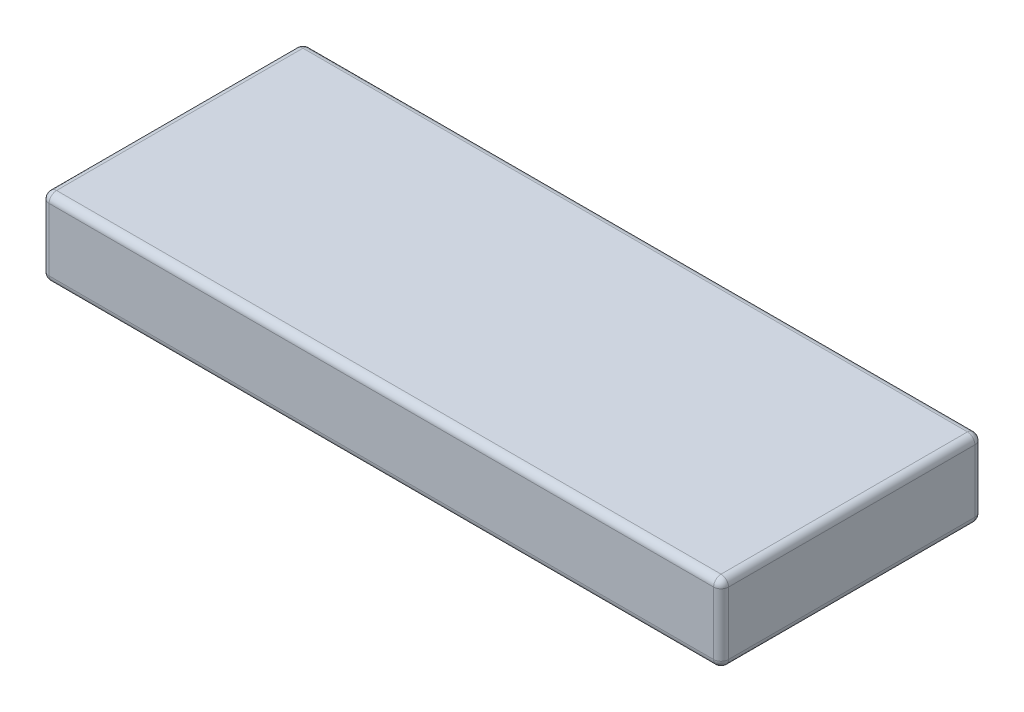
ISO-10303-21;
HEADER;
FILE_DESCRIPTION(('STEP AP214'),'2;1');
FILE_NAME('part.step','',(''),(''),'','','');
FILE_SCHEMA(('AUTOMOTIVE_DESIGN { 1 0 10303 214 1 1 1 1 }'));
ENDSEC;
DATA;
#1=APPLICATION_CONTEXT('core data for automotive mechanical design processes');
#2=APPLICATION_PROTOCOL_DEFINITION('international standard','automotive_design',2000,#1);
#3=PRODUCT_CONTEXT('',#1,'mechanical');
#4=PRODUCT('Part','Part','',(#3));
#5=PRODUCT_RELATED_PRODUCT_CATEGORY('part','',(#4));
#6=PRODUCT_DEFINITION_FORMATION('','',#4);
#7=PRODUCT_DEFINITION_CONTEXT('part definition',#1,'design');
#8=PRODUCT_DEFINITION('design','',#6,#7);
#9=PRODUCT_DEFINITION_SHAPE('','',#8);
#10=(LENGTH_UNIT() NAMED_UNIT(*) SI_UNIT(.MILLI.,.METRE.));
#11=(NAMED_UNIT(*) PLANE_ANGLE_UNIT() SI_UNIT($,.RADIAN.));
#12=(NAMED_UNIT(*) SI_UNIT($,.STERADIAN.) SOLID_ANGLE_UNIT());
#13=UNCERTAINTY_MEASURE_WITH_UNIT(LENGTH_MEASURE(1.E-05),#10,'distance_accuracy_value','');
#14=(GEOMETRIC_REPRESENTATION_CONTEXT(3) GLOBAL_UNCERTAINTY_ASSIGNED_CONTEXT((#13)) GLOBAL_UNIT_ASSIGNED_CONTEXT((#10,
#11,#12)) REPRESENTATION_CONTEXT('',''));
#15=CARTESIAN_POINT('',(0.,0.,0.));
#16=DIRECTION('',(0.,0.,1.));
#17=DIRECTION('',(1.,0.,0.));
#18=AXIS2_PLACEMENT_3D('',#15,#16,#17);
#19=CARTESIAN_POINT('',(22.25,-2.1,8.25));
#20=DIRECTION('',(1.,0.,0.));
#21=DIRECTION('',(0.,0.,-1.));
#22=AXIS2_PLACEMENT_3D('',#19,#20,#21);
#23=SPHERICAL_SURFACE('',#22,0.5);
#24=CARTESIAN_POINT('',(22.25,-2.1,8.25));
#25=DIRECTION('',(0.,-1.,0.));
#26=DIRECTION('',(0.,0.,-1.));
#27=AXIS2_PLACEMENT_3D('',#24,#25,#26);
#28=CIRCLE('',#27,0.5);
#29=CARTESIAN_POINT('',(22.25,-2.09999999999693,8.75));
#30=VERTEX_POINT('',#29);
#31=CARTESIAN_POINT('',(22.75,-2.1,8.25));
#32=VERTEX_POINT('',#31);
#33=EDGE_CURVE('E117',#30,#32,#28,.F.);
#34=ORIENTED_EDGE('',*,*,#33,.F.);
#35=CARTESIAN_POINT('',(22.25,-2.1,8.25));
#36=DIRECTION('',(-1.,0.,0.));
#37=DIRECTION('',(0.,0.,1.));
#38=AXIS2_PLACEMENT_3D('',#35,#36,#37);
#39=CIRCLE('',#38,0.5);
#40=CARTESIAN_POINT('',(22.25,-2.6,8.25));
#41=VERTEX_POINT('',#40);
#42=EDGE_CURVE('E115',#41,#30,#39,.T.);
#43=ORIENTED_EDGE('',*,*,#42,.F.);
#44=CARTESIAN_POINT('',(22.25,-2.1,8.25));
#45=DIRECTION('',(0.,0.,1.));
#46=DIRECTION('',(1.,0.,0.));
#47=AXIS2_PLACEMENT_3D('',#44,#45,#46);
#48=CIRCLE('',#47,0.5);
#49=EDGE_CURVE('E107',#32,#41,#48,.F.);
#50=ORIENTED_EDGE('',*,*,#49,.F.);
#51=EDGE_LOOP('',(#34,#43,#50));
#52=FACE_BOUND('',#51,.T.);
#53=ADVANCED_FACE('F17',(#52),#23,.T.);
#54=CARTESIAN_POINT('',(-22.25,-2.1,8.25));
#55=DIRECTION('',(1.,0.,0.));
#56=DIRECTION('',(0.,0.,-1.));
#57=AXIS2_PLACEMENT_3D('',#54,#55,#56);
#58=SPHERICAL_SURFACE('',#57,0.5);
#59=CARTESIAN_POINT('',(-22.25,-2.1,8.25));
#60=DIRECTION('',(0.,-1.,0.));
#61=DIRECTION('',(0.,0.,-1.));
#62=AXIS2_PLACEMENT_3D('',#59,#60,#61);
#63=CIRCLE('',#62,0.5);
#64=CARTESIAN_POINT('',(-22.75,-2.1,8.25));
#65=VERTEX_POINT('',#64);
#66=CARTESIAN_POINT('',(-22.25,-2.1,8.75));
#67=VERTEX_POINT('',#66);
#68=EDGE_CURVE('E130',#65,#67,#63,.F.);
#69=ORIENTED_EDGE('',*,*,#68,.F.);
#70=CARTESIAN_POINT('',(-22.25,-2.1,8.25));
#71=DIRECTION('',(0.,0.,-1.));
#72=DIRECTION('',(-1.,0.,0.));
#73=AXIS2_PLACEMENT_3D('',#70,#71,#72);
#74=CIRCLE('',#73,0.5);
#75=CARTESIAN_POINT('',(-22.25,-2.6,8.24999999999694));
#76=VERTEX_POINT('',#75);
#77=EDGE_CURVE('E310',#76,#65,#74,.T.);
#78=ORIENTED_EDGE('',*,*,#77,.F.);
#79=CARTESIAN_POINT('',(-22.25,-2.1,8.25));
#80=DIRECTION('',(-1.,0.,0.));
#81=DIRECTION('',(0.,0.,1.));
#82=AXIS2_PLACEMENT_3D('',#79,#80,#81);
#83=CIRCLE('',#82,0.5);
#84=EDGE_CURVE('E121',#67,#76,#83,.F.);
#85=ORIENTED_EDGE('',*,*,#84,.F.);
#86=EDGE_LOOP('',(#69,#78,#85));
#87=FACE_BOUND('',#86,.T.);
#88=ADVANCED_FACE('F155',(#87),#58,.T.);
#89=CARTESIAN_POINT('',(22.25,-2.1,-8.25));
#90=DIRECTION('',(1.,0.,0.));
#91=DIRECTION('',(0.,0.,-1.));
#92=AXIS2_PLACEMENT_3D('',#89,#90,#91);
#93=SPHERICAL_SURFACE('',#92,0.5);
#94=CARTESIAN_POINT('',(22.25,-2.1,-8.25));
#95=DIRECTION('',(0.,0.,1.));
#96=DIRECTION('',(1.,0.,0.));
#97=AXIS2_PLACEMENT_3D('',#94,#95,#96);
#98=CIRCLE('',#97,0.5);
#99=CARTESIAN_POINT('',(22.25,-2.6,-8.24999999999693));
#100=VERTEX_POINT('',#99);
#101=CARTESIAN_POINT('',(22.75,-2.1,-8.25));
#102=VERTEX_POINT('',#101);
#103=EDGE_CURVE('E136',#100,#102,#98,.T.);
#104=ORIENTED_EDGE('',*,*,#103,.F.);
#105=CARTESIAN_POINT('',(22.25,-2.1,-8.25));
#106=DIRECTION('',(1.,0.,0.));
#107=DIRECTION('',(0.,0.,-1.));
#108=AXIS2_PLACEMENT_3D('',#105,#106,#107);
#109=CIRCLE('',#108,0.5);
#110=CARTESIAN_POINT('',(22.25,-2.1,-8.75));
#111=VERTEX_POINT('',#110);
#112=EDGE_CURVE('E297',#111,#100,#109,.F.);
#113=ORIENTED_EDGE('',*,*,#112,.F.);
#114=CARTESIAN_POINT('',(22.25,-2.1,-8.25));
#115=DIRECTION('',(0.,-1.,0.));
#116=DIRECTION('',(0.,0.,-1.));
#117=AXIS2_PLACEMENT_3D('',#114,#115,#116);
#118=CIRCLE('',#117,0.5);
#119=EDGE_CURVE('E303',#102,#111,#118,.F.);
#120=ORIENTED_EDGE('',*,*,#119,.F.);
#121=EDGE_LOOP('',(#104,#113,#120));
#122=FACE_BOUND('',#121,.T.);
#123=ADVANCED_FACE('F153',(#122),#93,.T.);
#124=CARTESIAN_POINT('',(0.,-2.6,0.));
#125=DIRECTION('',(0.,-1.,0.));
#126=DIRECTION('',(0.,0.,-1.));
#127=AXIS2_PLACEMENT_3D('',#124,#125,#126);
#128=PLANE('',#127);
#129=DIRECTION('',(1.,0.,0.));
#130=VECTOR('',#129,1.);
#131=CARTESIAN_POINT('',(-22.75,-2.6,-8.25));
#132=LINE('',#131,#130);
#133=CARTESIAN_POINT('',(-22.25,-2.6,-8.25));
#134=VERTEX_POINT('',#133);
#135=EDGE_CURVE('E134',#100,#134,#132,.F.);
#136=ORIENTED_EDGE('',*,*,#135,.F.);
#137=DIRECTION('',(0.,0.,1.));
#138=VECTOR('',#137,1.);
#139=CARTESIAN_POINT('',(22.25,-2.6,8.75));
#140=LINE('',#139,#138);
#141=EDGE_CURVE('E103',#41,#100,#140,.F.);
#142=ORIENTED_EDGE('',*,*,#141,.F.);
#143=DIRECTION('',(-1.,0.,0.));
#144=VECTOR('',#143,1.);
#145=CARTESIAN_POINT('',(-22.75,-2.6,8.25));
#146=LINE('',#145,#144);
#147=EDGE_CURVE('E124',#76,#41,#146,.F.);
#148=ORIENTED_EDGE('',*,*,#147,.F.);
#149=DIRECTION('',(0.,0.,-1.));
#150=VECTOR('',#149,1.);
#151=CARTESIAN_POINT('',(-22.25,-2.6,8.75));
#152=LINE('',#151,#150);
#153=EDGE_CURVE('E305',#134,#76,#152,.F.);
#154=ORIENTED_EDGE('',*,*,#153,.F.);
#155=EDGE_LOOP('',(#136,#142,#148,#154));
#156=FACE_BOUND('',#155,.T.);
#157=ADVANCED_FACE('F132',(#156),#128,.T.);
#158=CARTESIAN_POINT('',(-22.25,-2.1,-8.25));
#159=DIRECTION('',(1.,0.,0.));
#160=DIRECTION('',(0.,0.,-1.));
#161=AXIS2_PLACEMENT_3D('',#158,#159,#160);
#162=SPHERICAL_SURFACE('',#161,0.5);
#163=CARTESIAN_POINT('',(-22.25,-2.1,-8.25));
#164=DIRECTION('',(0.,0.,-1.));
#165=DIRECTION('',(-1.,0.,0.));
#166=AXIS2_PLACEMENT_3D('',#163,#164,#165);
#167=CIRCLE('',#166,0.5);
#168=CARTESIAN_POINT('',(-22.75,-2.1,-8.25));
#169=VERTEX_POINT('',#168);
#170=EDGE_CURVE('E308',#169,#134,#167,.F.);
#171=ORIENTED_EDGE('',*,*,#170,.F.);
#172=CARTESIAN_POINT('',(-22.25,-2.1,-8.25));
#173=DIRECTION('',(0.,-1.,0.));
#174=DIRECTION('',(0.,0.,-1.));
#175=AXIS2_PLACEMENT_3D('',#172,#173,#174);
#176=CIRCLE('',#175,0.5);
#177=CARTESIAN_POINT('',(-22.25,-2.1,-8.75));
#178=VERTEX_POINT('',#177);
#179=EDGE_CURVE('E299',#178,#169,#176,.F.);
#180=ORIENTED_EDGE('',*,*,#179,.F.);
#181=CARTESIAN_POINT('',(-22.25,-2.1,-8.25));
#182=DIRECTION('',(1.,0.,0.));
#183=DIRECTION('',(0.,0.,-1.));
#184=AXIS2_PLACEMENT_3D('',#181,#182,#183);
#185=CIRCLE('',#184,0.5);
#186=EDGE_CURVE('E291',#134,#178,#185,.T.);
#187=ORIENTED_EDGE('',*,*,#186,.F.);
#188=EDGE_LOOP('',(#171,#180,#187));
#189=FACE_BOUND('',#188,.T.);
#190=ADVANCED_FACE('F145',(#189),#162,.T.);
#191=CARTESIAN_POINT('',(22.25,-2.1,8.75));
#192=DIRECTION('',(0.,0.,1.));
#193=DIRECTION('',(1.,0.,0.));
#194=AXIS2_PLACEMENT_3D('',#191,#192,#193);
#195=CYLINDRICAL_SURFACE('',#194,0.5);
#196=ORIENTED_EDGE('',*,*,#103,.T.);
#197=DIRECTION('',(0.,0.,1.));
#198=VECTOR('',#197,1.);
#199=CARTESIAN_POINT('',(22.75,-2.1,8.75));
#200=LINE('',#199,#198);
#201=EDGE_CURVE('E111',#102,#32,#200,.T.);
#202=ORIENTED_EDGE('',*,*,#201,.T.);
#203=ORIENTED_EDGE('',*,*,#49,.T.);
#204=ORIENTED_EDGE('',*,*,#141,.T.);
#205=EDGE_LOOP('',(#196,#202,#203,#204));
#206=FACE_BOUND('',#205,.T.);
#207=ADVANCED_FACE('F109',(#206),#195,.T.);
#208=CARTESIAN_POINT('',(22.25,2.6,8.25));
#209=DIRECTION('',(0.,-1.,0.));
#210=DIRECTION('',(0.,0.,-1.));
#211=AXIS2_PLACEMENT_3D('',#208,#209,#210);
#212=CYLINDRICAL_SURFACE('',#211,0.5);
#213=ORIENTED_EDGE('',*,*,#33,.T.);
#214=DIRECTION('',(0.,1.,0.));
#215=VECTOR('',#214,1.);
#216=CARTESIAN_POINT('',(22.75,2.6,8.25));
#217=LINE('',#216,#215);
#218=CARTESIAN_POINT('',(22.75,2.1,8.25));
#219=VERTEX_POINT('',#218);
#220=EDGE_CURVE('E285',#32,#219,#217,.T.);
#221=ORIENTED_EDGE('',*,*,#220,.T.);
#222=CARTESIAN_POINT('',(22.25,2.1,8.25));
#223=DIRECTION('',(0.,-1.,0.));
#224=DIRECTION('',(1.,0.,0.));
#225=AXIS2_PLACEMENT_3D('',#222,#223,#224);
#226=CIRCLE('',#225,0.5);
#227=CARTESIAN_POINT('',(22.25,2.1,8.75));
#228=VERTEX_POINT('',#227);
#229=EDGE_CURVE('E243',#228,#219,#226,.F.);
#230=ORIENTED_EDGE('',*,*,#229,.F.);
#231=DIRECTION('',(0.,1.,0.));
#232=VECTOR('',#231,1.);
#233=CARTESIAN_POINT('',(22.25,2.6,8.75));
#234=LINE('',#233,#232);
#235=EDGE_CURVE('E237',#228,#30,#234,.F.);
#236=ORIENTED_EDGE('',*,*,#235,.T.);
#237=EDGE_LOOP('',(#213,#221,#230,#236));
#238=FACE_BOUND('',#237,.T.);
#239=ADVANCED_FACE('F276',(#238),#212,.T.);
#240=CARTESIAN_POINT('',(-22.75,-2.1,8.25));
#241=DIRECTION('',(-1.,0.,0.));
#242=DIRECTION('',(0.,0.,1.));
#243=AXIS2_PLACEMENT_3D('',#240,#241,#242);
#244=CYLINDRICAL_SURFACE('',#243,0.5);
#245=ORIENTED_EDGE('',*,*,#84,.T.);
#246=ORIENTED_EDGE('',*,*,#147,.T.);
#247=ORIENTED_EDGE('',*,*,#42,.T.);
#248=DIRECTION('',(-1.,0.,0.));
#249=VECTOR('',#248,1.);
#250=CARTESIAN_POINT('',(-22.75,-2.1,8.75));
#251=LINE('',#250,#249);
#252=EDGE_CURVE('E235',#30,#67,#251,.T.);
#253=ORIENTED_EDGE('',*,*,#252,.T.);
#254=EDGE_LOOP('',(#245,#246,#247,#253));
#255=FACE_BOUND('',#254,.T.);
#256=ADVANCED_FACE('F125',(#255),#244,.T.);
#257=CARTESIAN_POINT('',(-22.25,2.6,8.25));
#258=DIRECTION('',(0.,-1.,0.));
#259=DIRECTION('',(0.,0.,-1.));
#260=AXIS2_PLACEMENT_3D('',#257,#258,#259);
#261=CYLINDRICAL_SURFACE('',#260,0.5);
#262=CARTESIAN_POINT('',(-22.25,2.1,8.25));
#263=DIRECTION('',(0.,-1.,6.13299445270928E-12));
#264=DIRECTION('',(1.,0.,0.));
#265=AXIS2_PLACEMENT_3D('',#262,#263,#264);
#266=CIRCLE('',#265,0.5);
#267=CARTESIAN_POINT('',(-22.75,2.1,8.25));
#268=VERTEX_POINT('',#267);
#269=CARTESIAN_POINT('',(-22.25,2.10000000000077,8.75));
#270=VERTEX_POINT('',#269);
#271=EDGE_CURVE('E233',#268,#270,#266,.F.);
#272=ORIENTED_EDGE('',*,*,#271,.F.);
#273=DIRECTION('',(0.,1.,0.));
#274=VECTOR('',#273,1.);
#275=CARTESIAN_POINT('',(-22.75,2.6,8.25));
#276=LINE('',#275,#274);
#277=EDGE_CURVE('E231',#268,#65,#276,.F.);
#278=ORIENTED_EDGE('',*,*,#277,.T.);
#279=ORIENTED_EDGE('',*,*,#68,.T.);
#280=DIRECTION('',(0.,1.,0.));
#281=VECTOR('',#280,1.);
#282=CARTESIAN_POINT('',(-22.25,2.6,8.75));
#283=LINE('',#282,#281);
#284=EDGE_CURVE('E240',#67,#270,#283,.T.);
#285=ORIENTED_EDGE('',*,*,#284,.T.);
#286=EDGE_LOOP('',(#272,#278,#279,#285));
#287=FACE_BOUND('',#286,.T.);
#288=ADVANCED_FACE('F270',(#287),#261,.T.);
#289=CARTESIAN_POINT('',(-22.25,-2.1,8.75));
#290=DIRECTION('',(0.,0.,-1.));
#291=DIRECTION('',(-1.,0.,0.));
#292=AXIS2_PLACEMENT_3D('',#289,#290,#291);
#293=CYLINDRICAL_SURFACE('',#292,0.5);
#294=ORIENTED_EDGE('',*,*,#170,.T.);
#295=ORIENTED_EDGE('',*,*,#153,.T.);
#296=ORIENTED_EDGE('',*,*,#77,.T.);
#297=DIRECTION('',(0.,0.,-1.));
#298=VECTOR('',#297,1.);
#299=CARTESIAN_POINT('',(-22.75,-2.1,8.75));
#300=LINE('',#299,#298);
#301=EDGE_CURVE('E324',#65,#169,#300,.T.);
#302=ORIENTED_EDGE('',*,*,#301,.T.);
#303=EDGE_LOOP('',(#294,#295,#296,#302));
#304=FACE_BOUND('',#303,.T.);
#305=ADVANCED_FACE('F266',(#304),#293,.T.);
#306=CARTESIAN_POINT('',(22.25,2.6,-8.25));
#307=DIRECTION('',(0.,-1.,0.));
#308=DIRECTION('',(0.,0.,-1.));
#309=AXIS2_PLACEMENT_3D('',#306,#307,#308);
#310=CYLINDRICAL_SURFACE('',#309,0.5);
#311=ORIENTED_EDGE('',*,*,#119,.T.);
#312=DIRECTION('',(0.,1.,0.));
#313=VECTOR('',#312,1.);
#314=CARTESIAN_POINT('',(22.25,2.6,-8.75));
#315=LINE('',#314,#313);
#316=CARTESIAN_POINT('',(22.25,2.1,-8.75));
#317=VERTEX_POINT('',#316);
#318=EDGE_CURVE('E206',#111,#317,#315,.T.);
#319=ORIENTED_EDGE('',*,*,#318,.T.);
#320=CARTESIAN_POINT('',(22.25,2.1,-8.25));
#321=DIRECTION('',(0.,1.,0.));
#322=DIRECTION('',(1.,0.,0.));
#323=AXIS2_PLACEMENT_3D('',#320,#321,#322);
#324=CIRCLE('',#323,0.5);
#325=CARTESIAN_POINT('',(22.75,2.1,-8.25));
#326=VERTEX_POINT('',#325);
#327=EDGE_CURVE('E209',#326,#317,#324,.T.);
#328=ORIENTED_EDGE('',*,*,#327,.F.);
#329=DIRECTION('',(0.,1.,0.));
#330=VECTOR('',#329,1.);
#331=CARTESIAN_POINT('',(22.75,2.6,-8.25));
#332=LINE('',#331,#330);
#333=EDGE_CURVE('E290',#326,#102,#332,.F.);
#334=ORIENTED_EDGE('',*,*,#333,.T.);
#335=EDGE_LOOP('',(#311,#319,#328,#334));
#336=FACE_BOUND('',#335,.T.);
#337=ADVANCED_FACE('F262',(#336),#310,.T.);
#338=CARTESIAN_POINT('',(-22.25,2.6,-8.25));
#339=DIRECTION('',(0.,-1.,0.));
#340=DIRECTION('',(0.,0.,-1.));
#341=AXIS2_PLACEMENT_3D('',#338,#339,#340);
#342=CYLINDRICAL_SURFACE('',#341,0.5);
#343=ORIENTED_EDGE('',*,*,#179,.T.);
#344=DIRECTION('',(0.,1.,0.));
#345=VECTOR('',#344,1.);
#346=CARTESIAN_POINT('',(-22.75,2.6,-8.25));
#347=LINE('',#346,#345);
#348=CARTESIAN_POINT('',(-22.75,2.1,-8.25));
#349=VERTEX_POINT('',#348);
#350=EDGE_CURVE('E377',#169,#349,#347,.T.);
#351=ORIENTED_EDGE('',*,*,#350,.T.);
#352=CARTESIAN_POINT('',(-22.25,2.1,-8.25));
#353=DIRECTION('',(0.,-1.,0.));
#354=DIRECTION('',(0.,0.,-1.));
#355=AXIS2_PLACEMENT_3D('',#352,#353,#354);
#356=CIRCLE('',#355,0.5);
#357=CARTESIAN_POINT('',(-22.25,2.1,-8.75));
#358=VERTEX_POINT('',#357);
#359=EDGE_CURVE('E301',#349,#358,#356,.T.);
#360=ORIENTED_EDGE('',*,*,#359,.T.);
#361=DIRECTION('',(0.,1.,0.));
#362=VECTOR('',#361,1.);
#363=CARTESIAN_POINT('',(-22.25,2.6,-8.75));
#364=LINE('',#363,#362);
#365=EDGE_CURVE('E203',#358,#178,#364,.F.);
#366=ORIENTED_EDGE('',*,*,#365,.T.);
#367=EDGE_LOOP('',(#343,#351,#360,#366));
#368=FACE_BOUND('',#367,.T.);
#369=ADVANCED_FACE('F258',(#368),#342,.T.);
#370=CARTESIAN_POINT('',(-22.75,-2.1,-8.25));
#371=DIRECTION('',(1.,0.,0.));
#372=DIRECTION('',(0.,0.,-1.));
#373=AXIS2_PLACEMENT_3D('',#370,#371,#372);
#374=CYLINDRICAL_SURFACE('',#373,0.5);
#375=ORIENTED_EDGE('',*,*,#186,.T.);
#376=DIRECTION('',(1.,0.,0.));
#377=VECTOR('',#376,1.);
#378=CARTESIAN_POINT('',(-22.75,-2.1,-8.75));
#379=LINE('',#378,#377);
#380=EDGE_CURVE('E200',#178,#111,#379,.T.);
#381=ORIENTED_EDGE('',*,*,#380,.T.);
#382=ORIENTED_EDGE('',*,*,#112,.T.);
#383=ORIENTED_EDGE('',*,*,#135,.T.);
#384=EDGE_LOOP('',(#375,#381,#382,#383));
#385=FACE_BOUND('',#384,.T.);
#386=ADVANCED_FACE('F254',(#385),#374,.T.);
#387=CARTESIAN_POINT('',(22.75,2.6,8.75));
#388=DIRECTION('',(-1.,0.,0.));
#389=DIRECTION('',(0.,0.,1.));
#390=AXIS2_PLACEMENT_3D('',#387,#388,#389);
#391=PLANE('',#390);
#392=ORIENTED_EDGE('',*,*,#333,.F.);
#393=DIRECTION('',(0.,0.,-1.));
#394=VECTOR('',#393,1.);
#395=CARTESIAN_POINT('',(22.75,2.1,0.));
#396=LINE('',#395,#394);
#397=EDGE_CURVE('E289',#219,#326,#396,.T.);
#398=ORIENTED_EDGE('',*,*,#397,.F.);
#399=ORIENTED_EDGE('',*,*,#220,.F.);
#400=ORIENTED_EDGE('',*,*,#201,.F.);
#401=EDGE_LOOP('',(#392,#398,#399,#400));
#402=FACE_BOUND('',#401,.T.);
#403=ADVANCED_FACE('F250',(#402),#391,.F.);
#404=CARTESIAN_POINT('',(22.25,2.1,8.25));
#405=DIRECTION('',(1.,0.,0.));
#406=DIRECTION('',(0.,0.,-1.));
#407=AXIS2_PLACEMENT_3D('',#404,#405,#406);
#408=SPHERICAL_SURFACE('',#407,0.5);
#409=ORIENTED_EDGE('',*,*,#229,.T.);
#410=CARTESIAN_POINT('',(22.25,2.1,8.25));
#411=DIRECTION('',(0.,0.,-1.));
#412=DIRECTION('',(-1.,0.,0.));
#413=AXIS2_PLACEMENT_3D('',#410,#411,#412);
#414=CIRCLE('',#413,0.5);
#415=CARTESIAN_POINT('',(22.25,2.6,8.25));
#416=VERTEX_POINT('',#415);
#417=EDGE_CURVE('E198',#416,#219,#414,.T.);
#418=ORIENTED_EDGE('',*,*,#417,.F.);
#419=CARTESIAN_POINT('',(22.25,2.1,8.25));
#420=DIRECTION('',(1.,0.,0.));
#421=DIRECTION('',(0.,0.,-1.));
#422=AXIS2_PLACEMENT_3D('',#419,#420,#421);
#423=CIRCLE('',#422,0.5);
#424=EDGE_CURVE('E357',#228,#416,#423,.F.);
#425=ORIENTED_EDGE('',*,*,#424,.F.);
#426=EDGE_LOOP('',(#409,#418,#425));
#427=FACE_BOUND('',#426,.T.);
#428=ADVANCED_FACE('F247',(#427),#408,.T.);
#429=CARTESIAN_POINT('',(-22.75,2.6,8.75));
#430=DIRECTION('',(0.,0.,-1.));
#431=DIRECTION('',(-1.,0.,0.));
#432=AXIS2_PLACEMENT_3D('',#429,#430,#431);
#433=PLANE('',#432);
#434=ORIENTED_EDGE('',*,*,#235,.F.);
#435=DIRECTION('',(1.,0.,0.));
#436=VECTOR('',#435,1.);
#437=CARTESIAN_POINT('',(0.,2.1,8.75));
#438=LINE('',#437,#436);
#439=EDGE_CURVE('E320',#270,#228,#438,.T.);
#440=ORIENTED_EDGE('',*,*,#439,.F.);
#441=ORIENTED_EDGE('',*,*,#284,.F.);
#442=ORIENTED_EDGE('',*,*,#252,.F.);
#443=EDGE_LOOP('',(#434,#440,#441,#442));
#444=FACE_BOUND('',#443,.T.);
#445=ADVANCED_FACE('F225',(#444),#433,.F.);
#446=CARTESIAN_POINT('',(-22.25,2.1,8.25));
#447=DIRECTION('',(1.,0.,0.));
#448=DIRECTION('',(0.,0.,-1.));
#449=AXIS2_PLACEMENT_3D('',#446,#447,#448);
#450=SPHERICAL_SURFACE('',#449,0.5);
#451=CARTESIAN_POINT('',(-22.25,2.1,8.25));
#452=DIRECTION('',(1.,0.,0.));
#453=DIRECTION('',(0.,0.,-1.));
#454=AXIS2_PLACEMENT_3D('',#451,#452,#453);
#455=CIRCLE('',#454,0.5);
#456=CARTESIAN_POINT('',(-22.25,2.6,8.25));
#457=VERTEX_POINT('',#456);
#458=EDGE_CURVE('E354',#457,#270,#455,.T.);
#459=ORIENTED_EDGE('',*,*,#458,.F.);
#460=CARTESIAN_POINT('',(-22.25,2.1,8.25));
#461=DIRECTION('',(0.,0.,1.));
#462=DIRECTION('',(1.,0.,0.));
#463=AXIS2_PLACEMENT_3D('',#460,#461,#462);
#464=CIRCLE('',#463,0.5);
#465=EDGE_CURVE('E351',#268,#457,#464,.F.);
#466=ORIENTED_EDGE('',*,*,#465,.F.);
#467=ORIENTED_EDGE('',*,*,#271,.T.);
#468=EDGE_LOOP('',(#459,#466,#467));
#469=FACE_BOUND('',#468,.T.);
#470=ADVANCED_FACE('F220',(#469),#450,.T.);
#471=CARTESIAN_POINT('',(-22.75,2.6,8.75));
#472=DIRECTION('',(1.,0.,0.));
#473=DIRECTION('',(0.,0.,-1.));
#474=AXIS2_PLACEMENT_3D('',#471,#472,#473);
#475=PLANE('',#474);
#476=ORIENTED_EDGE('',*,*,#350,.F.);
#477=ORIENTED_EDGE('',*,*,#301,.F.);
#478=ORIENTED_EDGE('',*,*,#277,.F.);
#479=DIRECTION('',(0.,0.,1.));
#480=VECTOR('',#479,1.);
#481=CARTESIAN_POINT('',(-22.75,2.1,0.));
#482=LINE('',#481,#480);
#483=EDGE_CURVE('E342',#349,#268,#482,.T.);
#484=ORIENTED_EDGE('',*,*,#483,.F.);
#485=EDGE_LOOP('',(#476,#477,#478,#484));
#486=FACE_BOUND('',#485,.T.);
#487=ADVANCED_FACE('F216',(#486),#475,.F.);
#488=CARTESIAN_POINT('',(22.25,2.1,-8.25));
#489=DIRECTION('',(1.,0.,0.));
#490=DIRECTION('',(0.,0.,-1.));
#491=AXIS2_PLACEMENT_3D('',#488,#489,#490);
#492=SPHERICAL_SURFACE('',#491,0.5);
#493=ORIENTED_EDGE('',*,*,#327,.T.);
#494=CARTESIAN_POINT('',(22.25,2.1,-8.25));
#495=DIRECTION('',(-1.,0.,0.));
#496=DIRECTION('',(0.,0.,1.));
#497=AXIS2_PLACEMENT_3D('',#494,#495,#496);
#498=CIRCLE('',#497,0.5);
#499=CARTESIAN_POINT('',(22.25,2.6,-8.25));
#500=VERTEX_POINT('',#499);
#501=EDGE_CURVE('E338',#500,#317,#498,.T.);
#502=ORIENTED_EDGE('',*,*,#501,.F.);
#503=CARTESIAN_POINT('',(22.25,2.1,-8.25));
#504=DIRECTION('',(0.,0.,-1.));
#505=DIRECTION('',(-1.,0.,0.));
#506=AXIS2_PLACEMENT_3D('',#503,#504,#505);
#507=CIRCLE('',#506,0.5);
#508=EDGE_CURVE('E359',#326,#500,#507,.F.);
#509=ORIENTED_EDGE('',*,*,#508,.F.);
#510=EDGE_LOOP('',(#493,#502,#509));
#511=FACE_BOUND('',#510,.T.);
#512=ADVANCED_FACE('F213',(#511),#492,.T.);
#513=CARTESIAN_POINT('',(-22.75,2.6,-8.75));
#514=DIRECTION('',(0.,0.,1.));
#515=DIRECTION('',(1.,0.,0.));
#516=AXIS2_PLACEMENT_3D('',#513,#514,#515);
#517=PLANE('',#516);
#518=ORIENTED_EDGE('',*,*,#365,.F.);
#519=DIRECTION('',(-1.,0.,0.));
#520=VECTOR('',#519,1.);
#521=CARTESIAN_POINT('',(0.,2.1,-8.75));
#522=LINE('',#521,#520);
#523=EDGE_CURVE('E336',#317,#358,#522,.T.);
#524=ORIENTED_EDGE('',*,*,#523,.F.);
#525=ORIENTED_EDGE('',*,*,#318,.F.);
#526=ORIENTED_EDGE('',*,*,#380,.F.);
#527=EDGE_LOOP('',(#518,#524,#525,#526));
#528=FACE_BOUND('',#527,.T.);
#529=ADVANCED_FACE('F192',(#528),#517,.F.);
#530=CARTESIAN_POINT('',(-22.25,2.1,-8.25));
#531=DIRECTION('',(1.,0.,0.));
#532=DIRECTION('',(0.,0.,-1.));
#533=AXIS2_PLACEMENT_3D('',#530,#531,#532);
#534=SPHERICAL_SURFACE('',#533,0.5);
#535=CARTESIAN_POINT('',(-22.25,2.1,-8.25));
#536=DIRECTION('',(-1.,0.,0.));
#537=DIRECTION('',(0.,0.,1.));
#538=AXIS2_PLACEMENT_3D('',#535,#536,#537);
#539=CIRCLE('',#538,0.5);
#540=CARTESIAN_POINT('',(-22.25,2.6,-8.25));
#541=VERTEX_POINT('',#540);
#542=EDGE_CURVE('E34',#358,#541,#539,.F.);
#543=ORIENTED_EDGE('',*,*,#542,.F.);
#544=ORIENTED_EDGE('',*,*,#359,.F.);
#545=CARTESIAN_POINT('',(-22.25,2.1,-8.25));
#546=DIRECTION('',(0.,0.,1.));
#547=DIRECTION('',(1.,0.,0.));
#548=AXIS2_PLACEMENT_3D('',#545,#546,#547);
#549=CIRCLE('',#548,0.5);
#550=EDGE_CURVE('E348',#541,#349,#549,.T.);
#551=ORIENTED_EDGE('',*,*,#550,.F.);
#552=EDGE_LOOP('',(#543,#544,#551));
#553=FACE_BOUND('',#552,.T.);
#554=ADVANCED_FACE('F187',(#553),#534,.T.);
#555=CARTESIAN_POINT('',(22.25,2.1,0.));
#556=DIRECTION('',(0.,0.,-1.));
#557=DIRECTION('',(-1.,0.,0.));
#558=AXIS2_PLACEMENT_3D('',#555,#556,#557);
#559=CYLINDRICAL_SURFACE('',#558,0.5);
#560=ORIENTED_EDGE('',*,*,#508,.T.);
#561=DIRECTION('',(0.,0.,-1.));
#562=VECTOR('',#561,1.);
#563=CARTESIAN_POINT('',(22.25,2.6,0.));
#564=LINE('',#563,#562);
#565=EDGE_CURVE('E340',#500,#416,#564,.F.);
#566=ORIENTED_EDGE('',*,*,#565,.T.);
#567=ORIENTED_EDGE('',*,*,#417,.T.);
#568=ORIENTED_EDGE('',*,*,#397,.T.);
#569=EDGE_LOOP('',(#560,#566,#567,#568));
#570=FACE_BOUND('',#569,.T.);
#571=ADVANCED_FACE('F183',(#570),#559,.T.);
#572=CARTESIAN_POINT('',(0.,2.1,8.25));
#573=DIRECTION('',(1.,0.,0.));
#574=DIRECTION('',(0.,0.,-1.));
#575=AXIS2_PLACEMENT_3D('',#572,#573,#574);
#576=CYLINDRICAL_SURFACE('',#575,0.5);
#577=ORIENTED_EDGE('',*,*,#458,.T.);
#578=ORIENTED_EDGE('',*,*,#439,.T.);
#579=ORIENTED_EDGE('',*,*,#424,.T.);
#580=DIRECTION('',(1.,0.,0.));
#581=VECTOR('',#580,1.);
#582=CARTESIAN_POINT('',(0.,2.6,8.25));
#583=LINE('',#582,#581);
#584=EDGE_CURVE('E367',#416,#457,#583,.F.);
#585=ORIENTED_EDGE('',*,*,#584,.T.);
#586=EDGE_LOOP('',(#577,#578,#579,#585));
#587=FACE_BOUND('',#586,.T.);
#588=ADVANCED_FACE('F179',(#587),#576,.T.);
#589=CARTESIAN_POINT('',(-22.25,2.1,0.));
#590=DIRECTION('',(0.,0.,1.));
#591=DIRECTION('',(1.,0.,0.));
#592=AXIS2_PLACEMENT_3D('',#589,#590,#591);
#593=CYLINDRICAL_SURFACE('',#592,0.5);
#594=ORIENTED_EDGE('',*,*,#550,.T.);
#595=ORIENTED_EDGE('',*,*,#483,.T.);
#596=ORIENTED_EDGE('',*,*,#465,.T.);
#597=DIRECTION('',(0.,0.,-1.));
#598=VECTOR('',#597,1.);
#599=CARTESIAN_POINT('',(-22.25,2.6,0.));
#600=LINE('',#599,#598);
#601=EDGE_CURVE('E26',#457,#541,#600,.T.);
#602=ORIENTED_EDGE('',*,*,#601,.T.);
#603=EDGE_LOOP('',(#594,#595,#596,#602));
#604=FACE_BOUND('',#603,.T.);
#605=ADVANCED_FACE('F173',(#604),#593,.T.);
#606=CARTESIAN_POINT('',(0.,2.1,-8.25));
#607=DIRECTION('',(-1.,0.,0.));
#608=DIRECTION('',(0.,0.,1.));
#609=AXIS2_PLACEMENT_3D('',#606,#607,#608);
#610=CYLINDRICAL_SURFACE('',#609,0.5);
#611=ORIENTED_EDGE('',*,*,#542,.T.);
#612=DIRECTION('',(1.,0.,0.));
#613=VECTOR('',#612,1.);
#614=CARTESIAN_POINT('',(0.,2.6,-8.25));
#615=LINE('',#614,#613);
#616=EDGE_CURVE('E11',#541,#500,#615,.T.);
#617=ORIENTED_EDGE('',*,*,#616,.T.);
#618=ORIENTED_EDGE('',*,*,#501,.T.);
#619=ORIENTED_EDGE('',*,*,#523,.T.);
#620=EDGE_LOOP('',(#611,#617,#618,#619));
#621=FACE_BOUND('',#620,.T.);
#622=ADVANCED_FACE('F167',(#621),#610,.T.);
#623=CARTESIAN_POINT('',(0.,2.6,0.));
#624=DIRECTION('',(0.,-1.,0.));
#625=DIRECTION('',(0.,0.,-1.));
#626=AXIS2_PLACEMENT_3D('',#623,#624,#625);
#627=PLANE('',#626);
#628=ORIENTED_EDGE('',*,*,#601,.F.);
#629=ORIENTED_EDGE('',*,*,#584,.F.);
#630=ORIENTED_EDGE('',*,*,#565,.F.);
#631=ORIENTED_EDGE('',*,*,#616,.F.);
#632=EDGE_LOOP('',(#628,#629,#630,#631));
#633=FACE_BOUND('',#632,.T.);
#634=ADVANCED_FACE('F165',(#633),#627,.F.);
#635=CLOSED_SHELL('',(#53,#88,#123,#157,#190,#207,#239,#256,#288,#305,#337,#369,#386,#403,#428,
#445,#470,#487,#512,#529,#554,#571,#588,#605,#622,#634));
#636=MANIFOLD_SOLID_BREP('B1',#635);
#637=ADVANCED_BREP_SHAPE_REPRESENTATION('',(#18,#636),#14);
#638=SHAPE_DEFINITION_REPRESENTATION(#9,#637);
ENDSEC;
END-ISO-10303-21;
